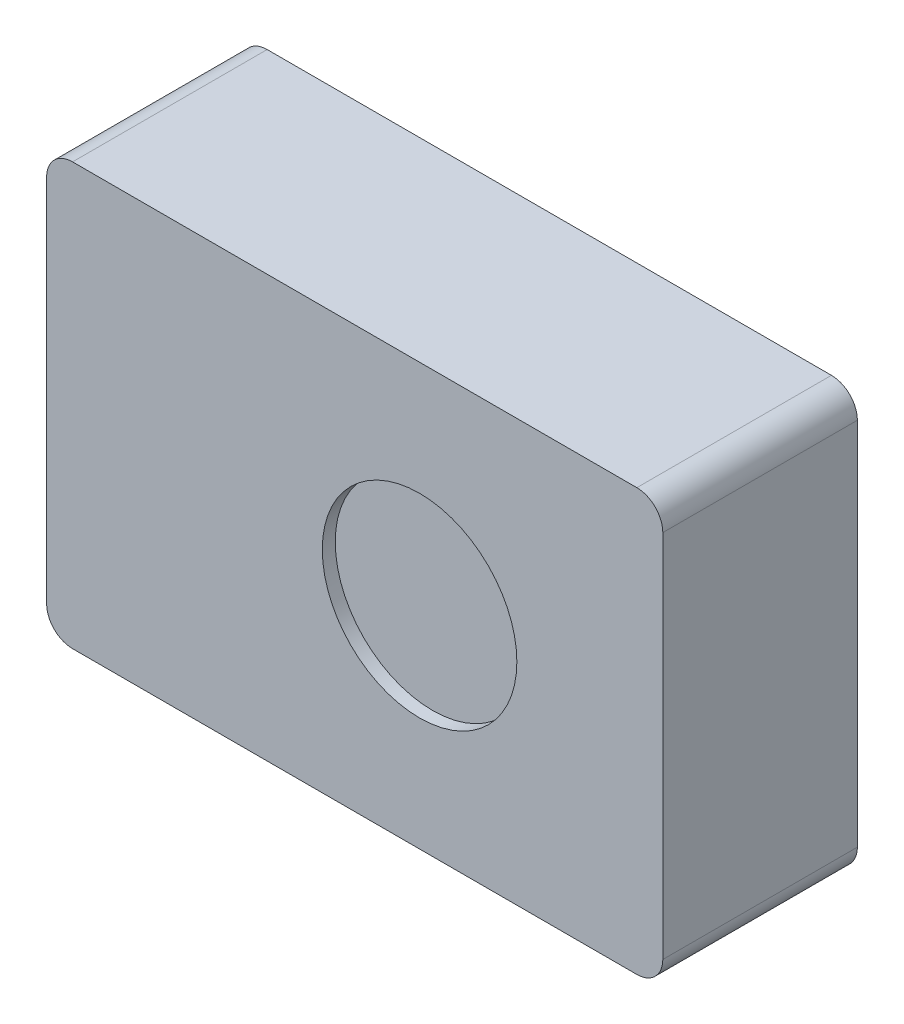
ISO-10303-21;
HEADER;
FILE_DESCRIPTION(('STEP AP214'),'2;1');
FILE_NAME('part.step','',(''),(''),'','','');
FILE_SCHEMA(('AUTOMOTIVE_DESIGN { 1 0 10303 214 1 1 1 1 }'));
ENDSEC;
DATA;
#1=APPLICATION_CONTEXT('core data for automotive mechanical design processes');
#2=APPLICATION_PROTOCOL_DEFINITION('international standard','automotive_design',2000,#1);
#3=PRODUCT_CONTEXT('',#1,'mechanical');
#4=PRODUCT('Part','Part','',(#3));
#5=PRODUCT_RELATED_PRODUCT_CATEGORY('part','',(#4));
#6=PRODUCT_DEFINITION_FORMATION('','',#4);
#7=PRODUCT_DEFINITION_CONTEXT('part definition',#1,'design');
#8=PRODUCT_DEFINITION('design','',#6,#7);
#9=PRODUCT_DEFINITION_SHAPE('','',#8);
#10=(LENGTH_UNIT() NAMED_UNIT(*) SI_UNIT(.MILLI.,.METRE.));
#11=(NAMED_UNIT(*) PLANE_ANGLE_UNIT() SI_UNIT($,.RADIAN.));
#12=(NAMED_UNIT(*) SI_UNIT($,.STERADIAN.) SOLID_ANGLE_UNIT());
#13=UNCERTAINTY_MEASURE_WITH_UNIT(LENGTH_MEASURE(1.E-05),#10,'distance_accuracy_value','');
#14=(GEOMETRIC_REPRESENTATION_CONTEXT(3) GLOBAL_UNCERTAINTY_ASSIGNED_CONTEXT((#13)) GLOBAL_UNIT_ASSIGNED_CONTEXT((#10,
#11,#12)) REPRESENTATION_CONTEXT('',''));
#15=CARTESIAN_POINT('',(0.,0.,0.));
#16=DIRECTION('',(0.,0.,1.));
#17=DIRECTION('',(1.,0.,0.));
#18=AXIS2_PLACEMENT_3D('',#15,#16,#17);
#19=CARTESIAN_POINT('',(-43.5,-28.5,30.));
#20=DIRECTION('',(0.,0.,-1.));
#21=DIRECTION('',(-1.,0.,0.));
#22=AXIS2_PLACEMENT_3D('',#19,#20,#21);
#23=CYLINDRICAL_SURFACE('',#22,4.);
#24=CARTESIAN_POINT('',(-43.5,-28.5,0.));
#25=DIRECTION('',(0.,0.,1.));
#26=DIRECTION('',(1.,0.,0.));
#27=AXIS2_PLACEMENT_3D('',#24,#25,#26);
#28=CIRCLE('',#27,4.);
#29=CARTESIAN_POINT('',(-47.5,-28.5,0.));
#30=VERTEX_POINT('',#29);
#31=CARTESIAN_POINT('',(-43.5,-32.5,0.));
#32=VERTEX_POINT('',#31);
#33=EDGE_CURVE('E146',#30,#32,#28,.T.);
#34=ORIENTED_EDGE('',*,*,#33,.T.);
#35=DIRECTION('',(0.,0.,-1.));
#36=VECTOR('',#35,1.);
#37=CARTESIAN_POINT('',(-43.5,-32.5,30.));
#38=LINE('',#37,#36);
#39=CARTESIAN_POINT('',(-43.5,-32.5,30.));
#40=VERTEX_POINT('',#39);
#41=EDGE_CURVE('E11',#40,#32,#38,.T.);
#42=ORIENTED_EDGE('',*,*,#41,.F.);
#43=CARTESIAN_POINT('',(-43.5,-28.5,30.));
#44=DIRECTION('',(0.,0.,1.));
#45=DIRECTION('',(1.,0.,0.));
#46=AXIS2_PLACEMENT_3D('',#43,#44,#45);
#47=CIRCLE('',#46,4.);
#48=CARTESIAN_POINT('',(-47.5,-28.5,30.));
#49=VERTEX_POINT('',#48);
#50=EDGE_CURVE('E169',#49,#40,#47,.T.);
#51=ORIENTED_EDGE('',*,*,#50,.F.);
#52=DIRECTION('',(0.,0.,-1.));
#53=VECTOR('',#52,1.);
#54=CARTESIAN_POINT('',(-47.5,-28.5,30.));
#55=LINE('',#54,#53);
#56=EDGE_CURVE('E145',#49,#30,#55,.T.);
#57=ORIENTED_EDGE('',*,*,#56,.T.);
#58=EDGE_LOOP('',(#34,#42,#51,#57));
#59=FACE_BOUND('',#58,.T.);
#60=ADVANCED_FACE('F44',(#59),#23,.T.);
#61=CARTESIAN_POINT('',(-43.5,-32.5,30.));
#62=DIRECTION('',(0.,1.,0.));
#63=DIRECTION('',(0.,0.,1.));
#64=AXIS2_PLACEMENT_3D('',#61,#62,#63);
#65=PLANE('',#64);
#66=DIRECTION('',(1.,0.,0.));
#67=VECTOR('',#66,1.);
#68=CARTESIAN_POINT('',(-43.5,-32.5,0.));
#69=LINE('',#68,#67);
#70=CARTESIAN_POINT('',(43.5,-32.5,0.));
#71=VERTEX_POINT('',#70);
#72=EDGE_CURVE('E149',#32,#71,#69,.T.);
#73=ORIENTED_EDGE('',*,*,#72,.T.);
#74=DIRECTION('',(0.,0.,-1.));
#75=VECTOR('',#74,1.);
#76=CARTESIAN_POINT('',(43.5,-32.5,30.));
#77=LINE('',#76,#75);
#78=CARTESIAN_POINT('',(43.5,-32.5,30.));
#79=VERTEX_POINT('',#78);
#80=EDGE_CURVE('E53',#79,#71,#77,.T.);
#81=ORIENTED_EDGE('',*,*,#80,.F.);
#82=DIRECTION('',(1.,0.,0.));
#83=VECTOR('',#82,1.);
#84=CARTESIAN_POINT('',(-43.5,-32.5,30.));
#85=LINE('',#84,#83);
#86=EDGE_CURVE('E102',#40,#79,#85,.T.);
#87=ORIENTED_EDGE('',*,*,#86,.F.);
#88=ORIENTED_EDGE('',*,*,#41,.T.);
#89=EDGE_LOOP('',(#73,#81,#87,#88));
#90=FACE_BOUND('',#89,.T.);
#91=ADVANCED_FACE('F236',(#90),#65,.F.);
#92=CARTESIAN_POINT('',(43.5,-28.5,30.));
#93=DIRECTION('',(0.,0.,-1.));
#94=DIRECTION('',(-1.,0.,0.));
#95=AXIS2_PLACEMENT_3D('',#92,#93,#94);
#96=CYLINDRICAL_SURFACE('',#95,4.);
#97=CARTESIAN_POINT('',(43.5,-28.5,0.));
#98=DIRECTION('',(0.,0.,1.));
#99=DIRECTION('',(1.,0.,0.));
#100=AXIS2_PLACEMENT_3D('',#97,#98,#99);
#101=CIRCLE('',#100,4.);
#102=CARTESIAN_POINT('',(47.5,-28.5,0.));
#103=VERTEX_POINT('',#102);
#104=EDGE_CURVE('E153',#71,#103,#101,.T.);
#105=ORIENTED_EDGE('',*,*,#104,.T.);
#106=DIRECTION('',(0.,0.,-1.));
#107=VECTOR('',#106,1.);
#108=CARTESIAN_POINT('',(47.5,-28.5,30.));
#109=LINE('',#108,#107);
#110=CARTESIAN_POINT('',(47.5,-28.5,30.));
#111=VERTEX_POINT('',#110);
#112=EDGE_CURVE('E179',#111,#103,#109,.T.);
#113=ORIENTED_EDGE('',*,*,#112,.F.);
#114=CARTESIAN_POINT('',(43.5,-28.5,30.));
#115=DIRECTION('',(0.,0.,1.));
#116=DIRECTION('',(1.,0.,0.));
#117=AXIS2_PLACEMENT_3D('',#114,#115,#116);
#118=CIRCLE('',#117,4.);
#119=EDGE_CURVE('E188',#79,#111,#118,.T.);
#120=ORIENTED_EDGE('',*,*,#119,.F.);
#121=ORIENTED_EDGE('',*,*,#80,.T.);
#122=EDGE_LOOP('',(#105,#113,#120,#121));
#123=FACE_BOUND('',#122,.T.);
#124=ADVANCED_FACE('F189',(#123),#96,.T.);
#125=CARTESIAN_POINT('',(47.5,-28.5,30.));
#126=DIRECTION('',(-1.,0.,0.));
#127=DIRECTION('',(0.,0.,1.));
#128=AXIS2_PLACEMENT_3D('',#125,#126,#127);
#129=PLANE('',#128);
#130=DIRECTION('',(0.,1.,0.));
#131=VECTOR('',#130,1.);
#132=CARTESIAN_POINT('',(47.5,-28.5,0.));
#133=LINE('',#132,#131);
#134=CARTESIAN_POINT('',(47.5,28.5,0.));
#135=VERTEX_POINT('',#134);
#136=EDGE_CURVE('E160',#103,#135,#133,.T.);
#137=ORIENTED_EDGE('',*,*,#136,.T.);
#138=DIRECTION('',(0.,0.,-1.));
#139=VECTOR('',#138,1.);
#140=CARTESIAN_POINT('',(47.5,28.5,30.));
#141=LINE('',#140,#139);
#142=CARTESIAN_POINT('',(47.5,28.5,30.));
#143=VERTEX_POINT('',#142);
#144=EDGE_CURVE('E176',#143,#135,#141,.T.);
#145=ORIENTED_EDGE('',*,*,#144,.F.);
#146=DIRECTION('',(0.,1.,0.));
#147=VECTOR('',#146,1.);
#148=CARTESIAN_POINT('',(47.5,-28.5,30.));
#149=LINE('',#148,#147);
#150=EDGE_CURVE('E201',#111,#143,#149,.T.);
#151=ORIENTED_EDGE('',*,*,#150,.F.);
#152=ORIENTED_EDGE('',*,*,#112,.T.);
#153=EDGE_LOOP('',(#137,#145,#151,#152));
#154=FACE_BOUND('',#153,.T.);
#155=ADVANCED_FACE('F199',(#154),#129,.F.);
#156=CARTESIAN_POINT('',(43.5,28.5,30.));
#157=DIRECTION('',(0.,0.,-1.));
#158=DIRECTION('',(-1.,0.,0.));
#159=AXIS2_PLACEMENT_3D('',#156,#157,#158);
#160=CYLINDRICAL_SURFACE('',#159,4.);
#161=CARTESIAN_POINT('',(43.5,28.5,0.));
#162=DIRECTION('',(0.,0.,1.));
#163=DIRECTION('',(1.,0.,0.));
#164=AXIS2_PLACEMENT_3D('',#161,#162,#163);
#165=CIRCLE('',#164,4.);
#166=CARTESIAN_POINT('',(43.5,32.5,0.));
#167=VERTEX_POINT('',#166);
#168=EDGE_CURVE('E157',#135,#167,#165,.T.);
#169=ORIENTED_EDGE('',*,*,#168,.T.);
#170=DIRECTION('',(0.,0.,-1.));
#171=VECTOR('',#170,1.);
#172=CARTESIAN_POINT('',(43.5,32.5,30.));
#173=LINE('',#172,#171);
#174=CARTESIAN_POINT('',(43.5,32.5,30.));
#175=VERTEX_POINT('',#174);
#176=EDGE_CURVE('E135',#175,#167,#173,.T.);
#177=ORIENTED_EDGE('',*,*,#176,.F.);
#178=CARTESIAN_POINT('',(43.5,28.5,30.));
#179=DIRECTION('',(0.,0.,1.));
#180=DIRECTION('',(1.,0.,0.));
#181=AXIS2_PLACEMENT_3D('',#178,#179,#180);
#182=CIRCLE('',#181,4.);
#183=EDGE_CURVE('E121',#143,#175,#182,.T.);
#184=ORIENTED_EDGE('',*,*,#183,.F.);
#185=ORIENTED_EDGE('',*,*,#144,.T.);
#186=EDGE_LOOP('',(#169,#177,#184,#185));
#187=FACE_BOUND('',#186,.T.);
#188=ADVANCED_FACE('F203',(#187),#160,.T.);
#189=CARTESIAN_POINT('',(43.5,32.5,30.));
#190=DIRECTION('',(0.,-1.,0.));
#191=DIRECTION('',(0.,0.,-1.));
#192=AXIS2_PLACEMENT_3D('',#189,#190,#191);
#193=PLANE('',#192);
#194=DIRECTION('',(-1.,0.,0.));
#195=VECTOR('',#194,1.);
#196=CARTESIAN_POINT('',(43.5,32.5,0.));
#197=LINE('',#196,#195);
#198=CARTESIAN_POINT('',(-43.5,32.5,0.));
#199=VERTEX_POINT('',#198);
#200=EDGE_CURVE('E134',#167,#199,#197,.T.);
#201=ORIENTED_EDGE('',*,*,#200,.T.);
#202=DIRECTION('',(0.,0.,-1.));
#203=VECTOR('',#202,1.);
#204=CARTESIAN_POINT('',(-43.5,32.5,30.));
#205=LINE('',#204,#203);
#206=CARTESIAN_POINT('',(-43.5,32.5,30.));
#207=VERTEX_POINT('',#206);
#208=EDGE_CURVE('E129',#207,#199,#205,.T.);
#209=ORIENTED_EDGE('',*,*,#208,.F.);
#210=DIRECTION('',(-1.,0.,0.));
#211=VECTOR('',#210,1.);
#212=CARTESIAN_POINT('',(43.5,32.5,30.));
#213=LINE('',#212,#211);
#214=EDGE_CURVE('E117',#175,#207,#213,.T.);
#215=ORIENTED_EDGE('',*,*,#214,.F.);
#216=ORIENTED_EDGE('',*,*,#176,.T.);
#217=EDGE_LOOP('',(#201,#209,#215,#216));
#218=FACE_BOUND('',#217,.T.);
#219=ADVANCED_FACE('F131',(#218),#193,.F.);
#220=CARTESIAN_POINT('',(-43.5,28.5,30.));
#221=DIRECTION('',(0.,0.,-1.));
#222=DIRECTION('',(-1.,0.,0.));
#223=AXIS2_PLACEMENT_3D('',#220,#221,#222);
#224=CYLINDRICAL_SURFACE('',#223,4.);
#225=CARTESIAN_POINT('',(-43.5,28.5,0.));
#226=DIRECTION('',(0.,0.,1.));
#227=DIRECTION('',(1.,0.,0.));
#228=AXIS2_PLACEMENT_3D('',#225,#226,#227);
#229=CIRCLE('',#228,4.);
#230=CARTESIAN_POINT('',(-47.5,28.5,0.));
#231=VERTEX_POINT('',#230);
#232=EDGE_CURVE('E93',#199,#231,#229,.T.);
#233=ORIENTED_EDGE('',*,*,#232,.T.);
#234=DIRECTION('',(0.,0.,-1.));
#235=VECTOR('',#234,1.);
#236=CARTESIAN_POINT('',(-47.5,28.5,30.));
#237=LINE('',#236,#235);
#238=CARTESIAN_POINT('',(-47.5,28.5,30.));
#239=VERTEX_POINT('',#238);
#240=EDGE_CURVE('E138',#239,#231,#237,.T.);
#241=ORIENTED_EDGE('',*,*,#240,.F.);
#242=CARTESIAN_POINT('',(-43.5,28.5,30.));
#243=DIRECTION('',(0.,0.,1.));
#244=DIRECTION('',(1.,0.,0.));
#245=AXIS2_PLACEMENT_3D('',#242,#243,#244);
#246=CIRCLE('',#245,4.);
#247=EDGE_CURVE('E125',#207,#239,#246,.T.);
#248=ORIENTED_EDGE('',*,*,#247,.F.);
#249=ORIENTED_EDGE('',*,*,#208,.T.);
#250=EDGE_LOOP('',(#233,#241,#248,#249));
#251=FACE_BOUND('',#250,.T.);
#252=ADVANCED_FACE('F136',(#251),#224,.T.);
#253=CARTESIAN_POINT('',(-47.5,28.5,30.));
#254=DIRECTION('',(1.,0.,0.));
#255=DIRECTION('',(0.,0.,-1.));
#256=AXIS2_PLACEMENT_3D('',#253,#254,#255);
#257=PLANE('',#256);
#258=DIRECTION('',(0.,-1.,0.));
#259=VECTOR('',#258,1.);
#260=CARTESIAN_POINT('',(-47.5,28.5,0.));
#261=LINE('',#260,#259);
#262=EDGE_CURVE('E97',#231,#30,#261,.T.);
#263=ORIENTED_EDGE('',*,*,#262,.T.);
#264=ORIENTED_EDGE('',*,*,#56,.F.);
#265=DIRECTION('',(0.,-1.,0.));
#266=VECTOR('',#265,1.);
#267=CARTESIAN_POINT('',(-47.5,28.5,30.));
#268=LINE('',#267,#266);
#269=EDGE_CURVE('E65',#239,#49,#268,.T.);
#270=ORIENTED_EDGE('',*,*,#269,.F.);
#271=ORIENTED_EDGE('',*,*,#240,.T.);
#272=EDGE_LOOP('',(#263,#264,#270,#271));
#273=FACE_BOUND('',#272,.T.);
#274=ADVANCED_FACE('F222',(#273),#257,.F.);
#275=CARTESIAN_POINT('',(-43.5,-28.5,30.));
#276=DIRECTION('',(0.,0.,1.));
#277=DIRECTION('',(1.,0.,0.));
#278=AXIS2_PLACEMENT_3D('',#275,#276,#277);
#279=PLANE('',#278);
#280=CARTESIAN_POINT('',(10.,0.,30.));
#281=DIRECTION('',(0.,0.,1.));
#282=DIRECTION('',(1.,0.,0.));
#283=AXIS2_PLACEMENT_3D('',#280,#281,#282);
#284=CIRCLE('',#283,15.);
#285=CARTESIAN_POINT('',(25.,0.,30.));
#286=VERTEX_POINT('',#285);
#287=EDGE_CURVE('E151',#286,#286,#284,.T.);
#288=ORIENTED_EDGE('',*,*,#287,.F.);
#289=EDGE_LOOP('',(#288));
#290=FACE_BOUND('',#289,.T.);
#291=ORIENTED_EDGE('',*,*,#50,.T.);
#292=ORIENTED_EDGE('',*,*,#86,.T.);
#293=ORIENTED_EDGE('',*,*,#119,.T.);
#294=ORIENTED_EDGE('',*,*,#150,.T.);
#295=ORIENTED_EDGE('',*,*,#183,.T.);
#296=ORIENTED_EDGE('',*,*,#214,.T.);
#297=ORIENTED_EDGE('',*,*,#247,.T.);
#298=ORIENTED_EDGE('',*,*,#269,.T.);
#299=EDGE_LOOP('',(#291,#292,#293,#294,#295,#296,#297,#298));
#300=FACE_BOUND('',#299,.T.);
#301=ADVANCED_FACE('F119',(#290,#300),#279,.T.);
#302=CARTESIAN_POINT('',(-43.5,-28.5,0.));
#303=DIRECTION('',(0.,0.,1.));
#304=DIRECTION('',(1.,0.,0.));
#305=AXIS2_PLACEMENT_3D('',#302,#303,#304);
#306=PLANE('',#305);
#307=ORIENTED_EDGE('',*,*,#33,.F.);
#308=ORIENTED_EDGE('',*,*,#262,.F.);
#309=ORIENTED_EDGE('',*,*,#232,.F.);
#310=ORIENTED_EDGE('',*,*,#200,.F.);
#311=ORIENTED_EDGE('',*,*,#168,.F.);
#312=ORIENTED_EDGE('',*,*,#136,.F.);
#313=ORIENTED_EDGE('',*,*,#104,.F.);
#314=ORIENTED_EDGE('',*,*,#72,.F.);
#315=EDGE_LOOP('',(#307,#308,#309,#310,#311,#312,#313,#314));
#316=FACE_BOUND('',#315,.T.);
#317=ADVANCED_FACE('F193',(#316),#306,.F.);
#318=CARTESIAN_POINT('',(10.,0.,30.));
#319=DIRECTION('',(0.,0.,-1.));
#320=DIRECTION('',(-1.,0.,0.));
#321=AXIS2_PLACEMENT_3D('',#318,#319,#320);
#322=CYLINDRICAL_SURFACE('',#321,15.);
#323=ORIENTED_EDGE('',*,*,#287,.T.);
#324=EDGE_LOOP('',(#323));
#325=FACE_BOUND('',#324,.T.);
#326=CARTESIAN_POINT('',(10.,0.,28.));
#327=DIRECTION('',(0.,0.,1.));
#328=DIRECTION('',(1.,0.,0.));
#329=AXIS2_PLACEMENT_3D('',#326,#327,#328);
#330=CIRCLE('',#329,15.);
#331=CARTESIAN_POINT('',(25.,0.,28.));
#332=VERTEX_POINT('',#331);
#333=EDGE_CURVE('E212',#332,#332,#330,.T.);
#334=ORIENTED_EDGE('',*,*,#333,.F.);
#335=EDGE_LOOP('',(#334));
#336=FACE_BOUND('',#335,.T.);
#337=ADVANCED_FACE('F223',(#325,#336),#322,.F.);
#338=CARTESIAN_POINT('',(10.,0.,28.));
#339=DIRECTION('',(0.,0.,1.));
#340=DIRECTION('',(1.,0.,0.));
#341=AXIS2_PLACEMENT_3D('',#338,#339,#340);
#342=PLANE('',#341);
#343=ORIENTED_EDGE('',*,*,#333,.T.);
#344=EDGE_LOOP('',(#343));
#345=FACE_BOUND('',#344,.T.);
#346=ADVANCED_FACE('F281',(#345),#342,.T.);
#347=CLOSED_SHELL('',(#60,#91,#124,#155,#188,#219,#252,#274,#301,#317,#337,#346));
#348=MANIFOLD_SOLID_BREP('B2',#347);
#349=ADVANCED_BREP_SHAPE_REPRESENTATION('',(#18,#348),#14);
#350=SHAPE_DEFINITION_REPRESENTATION(#9,#349);
ENDSEC;
END-ISO-10303-21;
